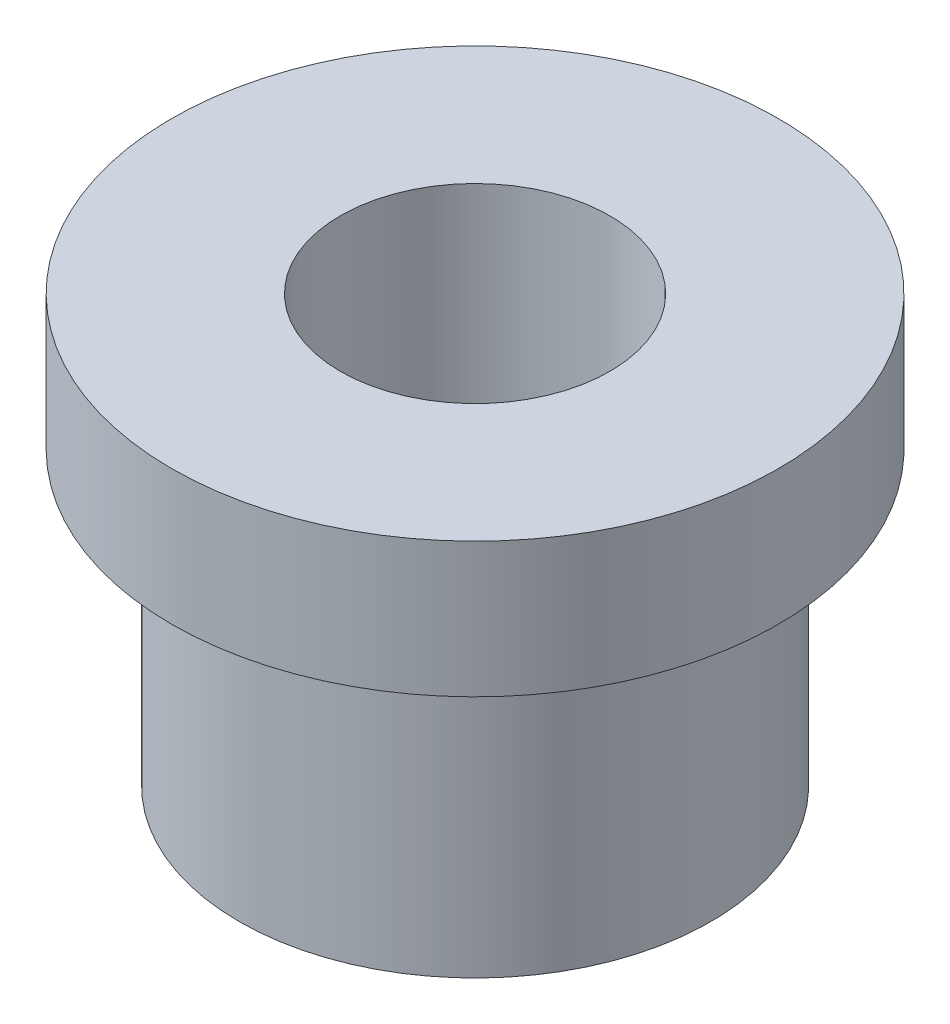
ISO-10303-21;
HEADER;
FILE_DESCRIPTION(('STEP AP214'),'2;1');
FILE_NAME('part.step','',(''),(''),'','','');
FILE_SCHEMA(('AUTOMOTIVE_DESIGN { 1 0 10303 214 1 1 1 1 }'));
ENDSEC;
DATA;
#1=APPLICATION_CONTEXT('core data for automotive mechanical design processes');
#2=APPLICATION_PROTOCOL_DEFINITION('international standard','automotive_design',2000,#1);
#3=PRODUCT_CONTEXT('',#1,'mechanical');
#4=PRODUCT('Part','Part','',(#3));
#5=PRODUCT_RELATED_PRODUCT_CATEGORY('part','',(#4));
#6=PRODUCT_DEFINITION_FORMATION('','',#4);
#7=PRODUCT_DEFINITION_CONTEXT('part definition',#1,'design');
#8=PRODUCT_DEFINITION('design','',#6,#7);
#9=PRODUCT_DEFINITION_SHAPE('','',#8);
#10=(LENGTH_UNIT() NAMED_UNIT(*) SI_UNIT(.MILLI.,.METRE.));
#11=(NAMED_UNIT(*) PLANE_ANGLE_UNIT() SI_UNIT($,.RADIAN.));
#12=(NAMED_UNIT(*) SI_UNIT($,.STERADIAN.) SOLID_ANGLE_UNIT());
#13=UNCERTAINTY_MEASURE_WITH_UNIT(LENGTH_MEASURE(1.E-05),#10,'distance_accuracy_value','');
#14=(GEOMETRIC_REPRESENTATION_CONTEXT(3) GLOBAL_UNCERTAINTY_ASSIGNED_CONTEXT((#13)) GLOBAL_UNIT_ASSIGNED_CONTEXT((#10,
#11,#12)) REPRESENTATION_CONTEXT('',''));
#15=CARTESIAN_POINT('',(0.,0.,0.));
#16=DIRECTION('',(0.,0.,1.));
#17=DIRECTION('',(1.,0.,0.));
#18=AXIS2_PLACEMENT_3D('',#15,#16,#17);
#19=CARTESIAN_POINT('',(0.,0.,0.));
#20=DIRECTION('',(0.,1.,0.));
#21=DIRECTION('',(0.,0.,1.));
#22=AXIS2_PLACEMENT_3D('',#19,#20,#21);
#23=PLANE('',#22);
#24=CARTESIAN_POINT('',(0.,0.,0.));
#25=DIRECTION('',(0.,1.,0.));
#26=DIRECTION('',(0.,0.,1.));
#27=AXIS2_PLACEMENT_3D('',#24,#25,#26);
#28=CIRCLE('',#27,11.1125);
#29=CARTESIAN_POINT('',(0.,0.,11.1125));
#30=VERTEX_POINT('',#29);
#31=EDGE_CURVE('E37',#30,#30,#28,.T.);
#32=ORIENTED_EDGE('',*,*,#31,.F.);
#33=EDGE_LOOP('',(#32));
#34=FACE_BOUND('',#33,.T.);
#35=CARTESIAN_POINT('',(0.,0.,0.));
#36=DIRECTION('',(0.,1.,0.));
#37=DIRECTION('',(0.,0.,1.));
#38=AXIS2_PLACEMENT_3D('',#35,#36,#37);
#39=CIRCLE('',#38,6.35);
#40=CARTESIAN_POINT('',(0.,0.,6.35));
#41=VERTEX_POINT('',#40);
#42=EDGE_CURVE('E44',#41,#41,#39,.T.);
#43=ORIENTED_EDGE('',*,*,#42,.T.);
#44=EDGE_LOOP('',(#43));
#45=FACE_BOUND('',#44,.T.);
#46=ADVANCED_FACE('F33',(#34,#45),#23,.F.);
#47=CARTESIAN_POINT('',(0.,13.716,0.));
#48=DIRECTION('',(0.,-1.,0.));
#49=DIRECTION('',(0.,0.,-1.));
#50=AXIS2_PLACEMENT_3D('',#47,#48,#49);
#51=CYLINDRICAL_SURFACE('',#50,11.1125);
#52=CARTESIAN_POINT('',(0.,13.716,0.));
#53=DIRECTION('',(0.,1.,0.));
#54=DIRECTION('',(0.,0.,1.));
#55=AXIS2_PLACEMENT_3D('',#52,#53,#54);
#56=CIRCLE('',#55,11.1125);
#57=CARTESIAN_POINT('',(0.,13.716,11.1125));
#58=VERTEX_POINT('',#57);
#59=EDGE_CURVE('E10',#58,#58,#56,.T.);
#60=ORIENTED_EDGE('',*,*,#59,.F.);
#61=EDGE_LOOP('',(#60));
#62=FACE_BOUND('',#61,.T.);
#63=ORIENTED_EDGE('',*,*,#31,.T.);
#64=EDGE_LOOP('',(#63));
#65=FACE_BOUND('',#64,.T.);
#66=ADVANCED_FACE('F35',(#62,#65),#51,.T.);
#67=CARTESIAN_POINT('',(0.,13.716,0.));
#68=DIRECTION('',(0.,-1.,0.));
#69=DIRECTION('',(0.,0.,-1.));
#70=AXIS2_PLACEMENT_3D('',#67,#68,#69);
#71=CYLINDRICAL_SURFACE('',#70,6.35);
#72=ORIENTED_EDGE('',*,*,#42,.F.);
#73=EDGE_LOOP('',(#72));
#74=FACE_BOUND('',#73,.T.);
#75=CARTESIAN_POINT('',(0.,20.066,0.));
#76=DIRECTION('',(0.,1.,0.));
#77=DIRECTION('',(0.,0.,1.));
#78=AXIS2_PLACEMENT_3D('',#75,#76,#77);
#79=CIRCLE('',#78,6.35);
#80=CARTESIAN_POINT('',(0.,20.066,6.35));
#81=VERTEX_POINT('',#80);
#82=EDGE_CURVE('E52',#81,#81,#79,.T.);
#83=ORIENTED_EDGE('',*,*,#82,.T.);
#84=EDGE_LOOP('',(#83));
#85=FACE_BOUND('',#84,.T.);
#86=ADVANCED_FACE('F58',(#74,#85),#71,.F.);
#87=CARTESIAN_POINT('',(0.,13.716,0.));
#88=DIRECTION('',(0.,1.,0.));
#89=DIRECTION('',(0.,0.,1.));
#90=AXIS2_PLACEMENT_3D('',#87,#88,#89);
#91=PLANE('',#90);
#92=CARTESIAN_POINT('',(0.,13.716,0.));
#93=DIRECTION('',(0.,1.,0.));
#94=DIRECTION('',(0.,0.,1.));
#95=AXIS2_PLACEMENT_3D('',#92,#93,#94);
#96=CIRCLE('',#95,14.2875);
#97=CARTESIAN_POINT('',(0.,13.716,14.2875));
#98=VERTEX_POINT('',#97);
#99=EDGE_CURVE('E49',#98,#98,#96,.T.);
#100=ORIENTED_EDGE('',*,*,#99,.F.);
#101=EDGE_LOOP('',(#100));
#102=FACE_BOUND('',#101,.T.);
#103=ORIENTED_EDGE('',*,*,#59,.T.);
#104=EDGE_LOOP('',(#103));
#105=FACE_BOUND('',#104,.T.);
#106=ADVANCED_FACE('F63',(#102,#105),#91,.F.);
#107=CARTESIAN_POINT('',(0.,20.066,0.));
#108=DIRECTION('',(0.,1.,0.));
#109=DIRECTION('',(0.,0.,1.));
#110=AXIS2_PLACEMENT_3D('',#107,#108,#109);
#111=PLANE('',#110);
#112=CARTESIAN_POINT('',(0.,20.066,0.));
#113=DIRECTION('',(0.,1.,0.));
#114=DIRECTION('',(0.,0.,1.));
#115=AXIS2_PLACEMENT_3D('',#112,#113,#114);
#116=CIRCLE('',#115,14.2875);
#117=CARTESIAN_POINT('',(0.,20.066,14.2875));
#118=VERTEX_POINT('',#117);
#119=EDGE_CURVE('E48',#118,#118,#116,.T.);
#120=ORIENTED_EDGE('',*,*,#119,.T.);
#121=EDGE_LOOP('',(#120));
#122=FACE_BOUND('',#121,.T.);
#123=ORIENTED_EDGE('',*,*,#82,.F.);
#124=EDGE_LOOP('',(#123));
#125=FACE_BOUND('',#124,.T.);
#126=ADVANCED_FACE('F60',(#122,#125),#111,.T.);
#127=CARTESIAN_POINT('',(0.,20.066,0.));
#128=DIRECTION('',(0.,-1.,0.));
#129=DIRECTION('',(0.,0.,-1.));
#130=AXIS2_PLACEMENT_3D('',#127,#128,#129);
#131=CYLINDRICAL_SURFACE('',#130,14.2875);
#132=ORIENTED_EDGE('',*,*,#119,.F.);
#133=EDGE_LOOP('',(#132));
#134=FACE_BOUND('',#133,.T.);
#135=ORIENTED_EDGE('',*,*,#99,.T.);
#136=EDGE_LOOP('',(#135));
#137=FACE_BOUND('',#136,.T.);
#138=ADVANCED_FACE('F62',(#134,#137),#131,.T.);
#139=CLOSED_SHELL('',(#46,#66,#86,#106,#126,#138));
#140=MANIFOLD_SOLID_BREP('B2',#139);
#141=ADVANCED_BREP_SHAPE_REPRESENTATION('',(#18,#140),#14);
#142=SHAPE_DEFINITION_REPRESENTATION(#9,#141);
ENDSEC;
END-ISO-10303-21;
